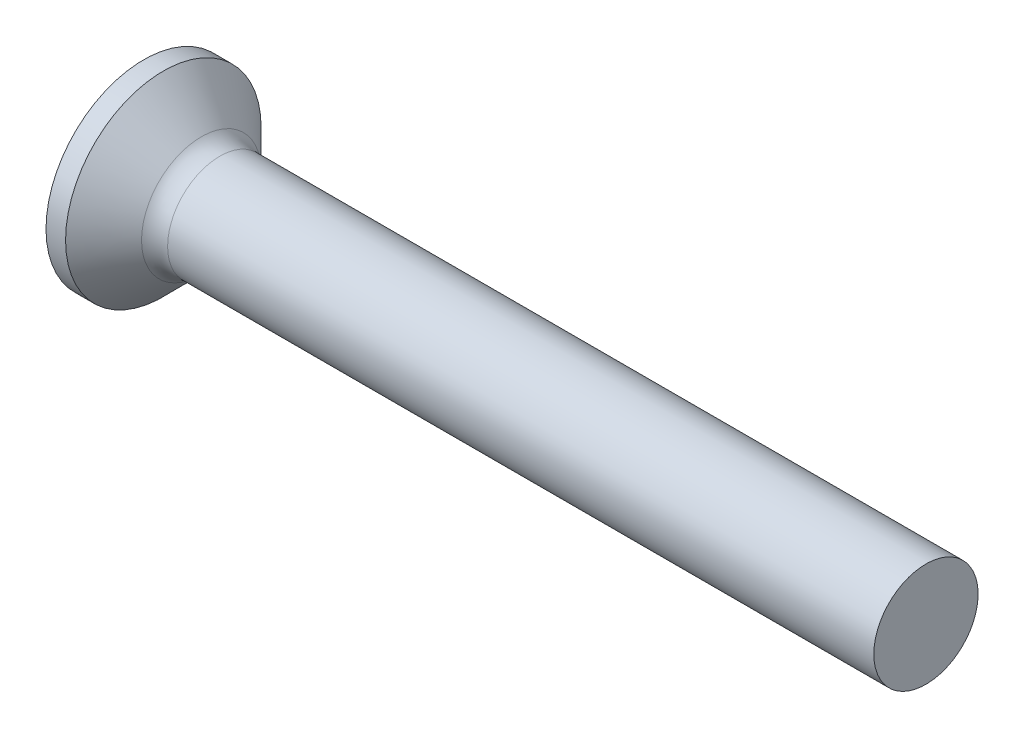
ISO-10303-21;
HEADER;
FILE_DESCRIPTION(('STEP AP214'),'2;1');
FILE_NAME('part.step','',(''),(''),'','','');
FILE_SCHEMA(('AUTOMOTIVE_DESIGN { 1 0 10303 214 1 1 1 1 }'));
ENDSEC;
DATA;
#1=APPLICATION_CONTEXT('core data for automotive mechanical design processes');
#2=APPLICATION_PROTOCOL_DEFINITION('international standard','automotive_design',2000,#1);
#3=PRODUCT_CONTEXT('',#1,'mechanical');
#4=PRODUCT('Part','Part','',(#3));
#5=PRODUCT_RELATED_PRODUCT_CATEGORY('part','',(#4));
#6=PRODUCT_DEFINITION_FORMATION('','',#4);
#7=PRODUCT_DEFINITION_CONTEXT('part definition',#1,'design');
#8=PRODUCT_DEFINITION('design','',#6,#7);
#9=PRODUCT_DEFINITION_SHAPE('','',#8);
#10=(LENGTH_UNIT() NAMED_UNIT(*) SI_UNIT(.MILLI.,.METRE.));
#11=(NAMED_UNIT(*) PLANE_ANGLE_UNIT() SI_UNIT($,.RADIAN.));
#12=(NAMED_UNIT(*) SI_UNIT($,.STERADIAN.) SOLID_ANGLE_UNIT());
#13=UNCERTAINTY_MEASURE_WITH_UNIT(LENGTH_MEASURE(1.E-05),#10,'distance_accuracy_value','');
#14=(GEOMETRIC_REPRESENTATION_CONTEXT(3) GLOBAL_UNCERTAINTY_ASSIGNED_CONTEXT((#13)) GLOBAL_UNIT_ASSIGNED_CONTEXT((#10,
#11,#12)) REPRESENTATION_CONTEXT('',''));
#15=CARTESIAN_POINT('',(0.,0.,0.));
#16=DIRECTION('',(0.,0.,1.));
#17=DIRECTION('',(1.,0.,0.));
#18=AXIS2_PLACEMENT_3D('',#15,#16,#17);
#19=CARTESIAN_POINT('',(0.,0.,0.));
#20=DIRECTION('',(-1.,0.,0.));
#21=DIRECTION('',(0.,0.,1.));
#22=AXIS2_PLACEMENT_3D('',#19,#20,#21);
#23=PLANE('',#22);
#24=CARTESIAN_POINT('',(0.,0.,0.));
#25=DIRECTION('',(-1.,0.,0.));
#26=DIRECTION('',(0.,0.,1.));
#27=AXIS2_PLACEMENT_3D('',#24,#25,#26);
#28=CIRCLE('',#27,1.5);
#29=CARTESIAN_POINT('',(0.,0.,1.5));
#30=VERTEX_POINT('',#29);
#31=EDGE_CURVE('E346',#30,#30,#28,.T.);
#32=ORIENTED_EDGE('',*,*,#31,.T.);
#33=EDGE_LOOP('',(#32));
#34=FACE_BOUND('',#33,.T.);
#35=DIRECTION('',(0.,0.,-1.));
#36=VECTOR('',#35,1.);
#37=CARTESIAN_POINT('',(0.,-0.240000000000003,0.799999999999999));
#38=LINE('',#37,#36);
#39=CARTESIAN_POINT('',(0.,-0.240000000000003,0.799999999999999));
#40=VERTEX_POINT('',#39);
#41=CARTESIAN_POINT('',(0.,-0.240000000000001,0.347023518872328));
#42=VERTEX_POINT('',#41);
#43=EDGE_CURVE('E384',#40,#42,#38,.T.);
#44=ORIENTED_EDGE('',*,*,#43,.T.);
#45=CARTESIAN_POINT('',(0.,0.,0.));
#46=DIRECTION('',(-1.,0.,0.));
#47=DIRECTION('',(0.,0.,1.));
#48=AXIS2_PLACEMENT_3D('',#45,#46,#47);
#49=CIRCLE('',#48,0.421930471346327);
#50=CARTESIAN_POINT('',(0.,-0.347023518872329,0.24));
#51=VERTEX_POINT('',#50);
#52=EDGE_CURVE('E372',#51,#42,#49,.T.);
#53=ORIENTED_EDGE('',*,*,#52,.F.);
#54=DIRECTION('',(0.,-1.,0.));
#55=VECTOR('',#54,1.);
#56=CARTESIAN_POINT('',(0.,0.8,0.24));
#57=LINE('',#56,#55);
#58=CARTESIAN_POINT('',(0.,-0.8,0.24));
#59=VERTEX_POINT('',#58);
#60=EDGE_CURVE('E431',#51,#59,#57,.T.);
#61=ORIENTED_EDGE('',*,*,#60,.T.);
#62=DIRECTION('',(0.,0.,-1.));
#63=VECTOR('',#62,1.);
#64=CARTESIAN_POINT('',(0.,-0.8,0.24));
#65=LINE('',#64,#63);
#66=CARTESIAN_POINT('',(0.,-0.8,-0.239999999999999));
#67=VERTEX_POINT('',#66);
#68=EDGE_CURVE('E343',#59,#67,#65,.T.);
#69=ORIENTED_EDGE('',*,*,#68,.T.);
#70=DIRECTION('',(0.,1.,0.));
#71=VECTOR('',#70,1.);
#72=CARTESIAN_POINT('',(0.,-0.8,-0.239999999999999));
#73=LINE('',#72,#71);
#74=CARTESIAN_POINT('',(0.,-0.34702351887233,-0.239999999999999));
#75=VERTEX_POINT('',#74);
#76=EDGE_CURVE('E432',#67,#75,#73,.T.);
#77=ORIENTED_EDGE('',*,*,#76,.T.);
#78=CARTESIAN_POINT('',(0.,-0.239999999999999,-0.34702351887233));
#79=VERTEX_POINT('',#78);
#80=EDGE_CURVE('E378',#79,#75,#49,.T.);
#81=ORIENTED_EDGE('',*,*,#80,.F.);
#82=CARTESIAN_POINT('',(0.,-0.239999999999997,-0.800000000000001));
#83=VERTEX_POINT('',#82);
#84=EDGE_CURVE('E393',#79,#83,#38,.T.);
#85=ORIENTED_EDGE('',*,*,#84,.T.);
#86=DIRECTION('',(0.,1.,0.));
#87=VECTOR('',#86,1.);
#88=CARTESIAN_POINT('',(0.,-0.239999999999997,-0.800000000000001));
#89=LINE('',#88,#87);
#90=CARTESIAN_POINT('',(0.,0.240000000000002,-0.799999999999999));
#91=VERTEX_POINT('',#90);
#92=EDGE_CURVE('E392',#83,#91,#89,.T.);
#93=ORIENTED_EDGE('',*,*,#92,.T.);
#94=DIRECTION('',(0.,0.,1.));
#95=VECTOR('',#94,1.);
#96=CARTESIAN_POINT('',(0.,0.240000000000002,-0.799999999999999));
#97=LINE('',#96,#95);
#98=CARTESIAN_POINT('',(0.,0.240000000000001,-0.347023518872329));
#99=VERTEX_POINT('',#98);
#100=EDGE_CURVE('E399',#91,#99,#97,.T.);
#101=ORIENTED_EDGE('',*,*,#100,.T.);
#102=CARTESIAN_POINT('',(0.,0.34702351887233,-0.239999999999999));
#103=VERTEX_POINT('',#102);
#104=EDGE_CURVE('E466',#103,#99,#49,.T.);
#105=ORIENTED_EDGE('',*,*,#104,.F.);
#106=CARTESIAN_POINT('',(0.,0.8,-0.239999999999999));
#107=VERTEX_POINT('',#106);
#108=EDGE_CURVE('E440',#103,#107,#73,.T.);
#109=ORIENTED_EDGE('',*,*,#108,.T.);
#110=DIRECTION('',(0.,0.,1.));
#111=VECTOR('',#110,1.);
#112=CARTESIAN_POINT('',(0.,0.8,-0.239999999999999));
#113=LINE('',#112,#111);
#114=CARTESIAN_POINT('',(0.,0.8,0.24));
#115=VERTEX_POINT('',#114);
#116=EDGE_CURVE('E428',#107,#115,#113,.T.);
#117=ORIENTED_EDGE('',*,*,#116,.T.);
#118=CARTESIAN_POINT('',(0.,0.347023518872329,0.24));
#119=VERTEX_POINT('',#118);
#120=EDGE_CURVE('E433',#115,#119,#57,.T.);
#121=ORIENTED_EDGE('',*,*,#120,.T.);
#122=CARTESIAN_POINT('',(0.,0.239999999999998,0.34702351887233));
#123=VERTEX_POINT('',#122);
#124=EDGE_CURVE('E380',#123,#119,#49,.T.);
#125=ORIENTED_EDGE('',*,*,#124,.F.);
#126=CARTESIAN_POINT('',(0.,0.239999999999997,0.800000000000001));
#127=VERTEX_POINT('',#126);
#128=EDGE_CURVE('E402',#123,#127,#97,.T.);
#129=ORIENTED_EDGE('',*,*,#128,.T.);
#130=DIRECTION('',(0.,-1.,0.));
#131=VECTOR('',#130,1.);
#132=CARTESIAN_POINT('',(0.,0.239999999999997,0.800000000000001));
#133=LINE('',#132,#131);
#134=EDGE_CURVE('E391',#127,#40,#133,.T.);
#135=ORIENTED_EDGE('',*,*,#134,.T.);
#136=EDGE_LOOP('',(#44,#53,#61,#69,#77,#81,#85,#93,#101,#105,#109,#117,#121,#125,#129,#135));
#137=FACE_BOUND('',#136,.T.);
#138=ADVANCED_FACE('F35',(#34,#137),#23,.T.);
#139=CARTESIAN_POINT('',(0.95,-0.326347488692666,0.24));
#140=DIRECTION('',(0.,0.,-1.));
#141=DIRECTION('',(-1.,0.,0.));
#142=AXIS2_PLACEMENT_3D('',#139,#140,#141);
#143=PLANE('',#142);
#144=ORIENTED_EDGE('',*,*,#60,.F.);
#145=CARTESIAN_POINT('',(-0.651308324051186,-0.401163684302684,0.24));
#146=CARTESIAN_POINT('',(-0.522861863423229,-0.390692537611785,0.24));
#147=CARTESIAN_POINT('',(-0.394423280810911,-0.380122888200533,0.24));
#148=CARTESIAN_POINT('',(-0.137565725712791,-0.35870652715565,0.24));
#149=CARTESIAN_POINT('',(-0.00914675385586902,-0.347859807988965,0.24));
#150=CARTESIAN_POINT('',(0.247660709587631,-0.325809813961883,0.24));
#151=CARTESIAN_POINT('',(0.37604920117974,-0.31460653916624,0.24));
#152=CARTESIAN_POINT('',(0.632780200612272,-0.291709176963063,0.24));
#153=CARTESIAN_POINT('',(0.761122709211896,-0.280015098074868,0.24));
#154=CARTESIAN_POINT('',(1.03836859128507,-0.253994892877437,0.24));
#155=CARTESIAN_POINT('',(1.18726080464485,-0.239547839796262,0.24));
#156=CARTESIAN_POINT('',(1.41048207830554,-0.216688570727189,0.24));
#157=CARTESIAN_POINT('',(1.48487148618842,-0.208870492985274,0.240000000000001));
#158=CARTESIAN_POINT('',(1.63358847070035,-0.192653926901128,0.240000000000001));
#159=CARTESIAN_POINT('',(1.70791604589332,-0.184255425439444,0.240000000000001));
#160=CARTESIAN_POINT('',(1.78220022482756,-0.175474749355936,0.240000000000001));
#161=B_SPLINE_CURVE_WITH_KNOTS('',3,(#145,#146,#147,#148,#149,#150,#151,#152,#153,#154,#155,
#156,#157,#158,#159,#160),.UNSPECIFIED.,.F.,.F.,(4,2,2,2,2,2,2,4),(0.,0.386617875839184,
0.77324627436866,1.15987460268182,1.54649622270294,1.99526496205244,2.21966034721123,
2.44406080609181),.UNSPECIFIED.);
#162=CARTESIAN_POINT('',(0.95,-0.262259890185288,0.24));
#163=VERTEX_POINT('',#162);
#164=EDGE_CURVE('E375',#51,#163,#161,.T.);
#165=ORIENTED_EDGE('',*,*,#164,.T.);
#166=DIRECTION('',(0.,-1.,0.));
#167=VECTOR('',#166,1.);
#168=CARTESIAN_POINT('',(0.95,0.326347488692666,0.24));
#169=LINE('',#168,#167);
#170=CARTESIAN_POINT('',(0.95,-0.326347488692666,0.24));
#171=VERTEX_POINT('',#170);
#172=EDGE_CURVE('E447',#163,#171,#169,.T.);
#173=ORIENTED_EDGE('',*,*,#172,.T.);
#174=DIRECTION('',(0.89493436774996,0.446197800778958,0.));
#175=VECTOR('',#174,1.);
#176=CARTESIAN_POINT('',(0.,-0.8,0.24));
#177=LINE('',#176,#175);
#178=EDGE_CURVE('E321',#59,#171,#177,.T.);
#179=ORIENTED_EDGE('',*,*,#178,.F.);
#180=EDGE_LOOP('',(#144,#165,#173,#179));
#181=FACE_BOUND('',#180,.T.);
#182=ADVANCED_FACE('F189',(#181),#143,.T.);
#183=CARTESIAN_POINT('',(0.95,0.326347488692666,0.24));
#184=VERTEX_POINT('',#183);
#185=CARTESIAN_POINT('',(0.95,0.262259890185288,0.24));
#186=VERTEX_POINT('',#185);
#187=EDGE_CURVE('E330',#184,#186,#169,.T.);
#188=ORIENTED_EDGE('',*,*,#187,.T.);
#189=CARTESIAN_POINT('',(-0.651308324051403,0.401163684302702,0.239999999999999));
#190=CARTESIAN_POINT('',(-0.522861863423424,0.390692537611801,0.24));
#191=CARTESIAN_POINT('',(-0.394423280811084,0.380122888200548,0.24));
#192=CARTESIAN_POINT('',(-0.137565725712921,0.358706527155661,0.24));
#193=CARTESIAN_POINT('',(-0.00914675385597726,0.347859807988975,0.24));
#194=CARTESIAN_POINT('',(0.247660709587598,0.325809813961886,0.24));
#195=CARTESIAN_POINT('',(0.37604920117976,0.314606539166238,0.24));
#196=CARTESIAN_POINT('',(0.632780200612397,0.291709176963051,0.24));
#197=CARTESIAN_POINT('',(0.761122709212074,0.280015098074852,0.24));
#198=CARTESIAN_POINT('',(1.0383685912853,0.253994892877415,0.24));
#199=CARTESIAN_POINT('',(1.18726080464508,0.239547839796239,0.24));
#200=CARTESIAN_POINT('',(1.41048207830576,0.216688570727165,0.24));
#201=CARTESIAN_POINT('',(1.48487148618865,0.208870492985249,0.24));
#202=CARTESIAN_POINT('',(1.63358847070058,0.192653926901103,0.24));
#203=CARTESIAN_POINT('',(1.70791604589355,0.184255425439417,0.240000000000001));
#204=CARTESIAN_POINT('',(1.78220022482779,0.175474749355909,0.240000000000001));
#205=B_SPLINE_CURVE_WITH_KNOTS('',3,(#189,#190,#191,#192,#193,#194,#195,#196,#197,#198,#199,
#200,#201,#202,#203,#204),.UNSPECIFIED.,.F.,.F.,(4,2,2,2,2,2,2,4),(0.,0.386617875839249,
0.773246274368791,1.15987460268211,1.54649622270339,1.99526496205289,2.21966034721168,
2.44406080609226),.UNSPECIFIED.);
#206=EDGE_CURVE('E249',#186,#119,#205,.F.);
#207=ORIENTED_EDGE('',*,*,#206,.T.);
#208=ORIENTED_EDGE('',*,*,#120,.F.);
#209=DIRECTION('',(0.89493436774996,-0.446197800778958,0.));
#210=VECTOR('',#209,1.);
#211=CARTESIAN_POINT('',(0.,0.8,0.24));
#212=LINE('',#211,#210);
#213=EDGE_CURVE('E58',#115,#184,#212,.T.);
#214=ORIENTED_EDGE('',*,*,#213,.T.);
#215=EDGE_LOOP('',(#188,#207,#208,#214));
#216=FACE_BOUND('',#215,.T.);
#217=ADVANCED_FACE('F194',(#216),#143,.T.);
#218=CARTESIAN_POINT('',(0.95,0.326347488692666,-0.24));
#219=DIRECTION('',(0.,0.,1.));
#220=DIRECTION('',(1.,0.,0.));
#221=AXIS2_PLACEMENT_3D('',#218,#219,#220);
#222=PLANE('',#221);
#223=DIRECTION('',(0.,1.,0.));
#224=VECTOR('',#223,1.);
#225=CARTESIAN_POINT('',(0.95,-0.326347488692666,-0.24));
#226=LINE('',#225,#224);
#227=CARTESIAN_POINT('',(0.95,-0.326347488692666,-0.24));
#228=VERTEX_POINT('',#227);
#229=CARTESIAN_POINT('',(0.95,-0.262259890185288,-0.239999999999999));
#230=VERTEX_POINT('',#229);
#231=EDGE_CURVE('E334',#228,#230,#226,.T.);
#232=ORIENTED_EDGE('',*,*,#231,.T.);
#233=CARTESIAN_POINT('',(-0.651308324051186,-0.401163684302684,-0.239999999999999));
#234=CARTESIAN_POINT('',(-0.522861863423229,-0.390692537611785,-0.239999999999999));
#235=CARTESIAN_POINT('',(-0.394423280810911,-0.380122888200534,-0.239999999999999));
#236=CARTESIAN_POINT('',(-0.137565725712791,-0.358706527155651,-0.239999999999999));
#237=CARTESIAN_POINT('',(-0.00914675385586895,-0.347859807988966,-0.239999999999999));
#238=CARTESIAN_POINT('',(0.247660709587631,-0.325809813961883,-0.239999999999999));
#239=CARTESIAN_POINT('',(0.376049201179741,-0.31460653916624,-0.24));
#240=CARTESIAN_POINT('',(0.632780200612273,-0.291709176963063,-0.24));
#241=CARTESIAN_POINT('',(0.761122709211897,-0.280015098074868,-0.24));
#242=CARTESIAN_POINT('',(1.03836859128507,-0.253994892877438,-0.24));
#243=CARTESIAN_POINT('',(1.18726080464485,-0.239547839796262,-0.24));
#244=CARTESIAN_POINT('',(1.41048207830554,-0.216688570727189,-0.24));
#245=CARTESIAN_POINT('',(1.48487148618842,-0.208870492985274,-0.24));
#246=CARTESIAN_POINT('',(1.63358847070035,-0.192653926901128,-0.24));
#247=CARTESIAN_POINT('',(1.70791604589332,-0.184255425439444,-0.24));
#248=CARTESIAN_POINT('',(1.78220022482756,-0.175474749355936,-0.240000000000001));
#249=B_SPLINE_CURVE_WITH_KNOTS('',3,(#233,#234,#235,#236,#237,#238,#239,#240,#241,#242,#243,
#244,#245,#246,#247,#248),.UNSPECIFIED.,.F.,.F.,(4,2,2,2,2,2,2,4),(0.,0.386617875839184,
0.77324627436866,1.15987460268182,1.54649622270294,1.99526496205244,2.21966034721123,
2.44406080609181),.UNSPECIFIED.);
#250=EDGE_CURVE('E243',#230,#75,#249,.F.);
#251=ORIENTED_EDGE('',*,*,#250,.T.);
#252=ORIENTED_EDGE('',*,*,#76,.F.);
#253=DIRECTION('',(0.89493436774996,0.446197800778958,0.));
#254=VECTOR('',#253,1.);
#255=CARTESIAN_POINT('',(0.,-0.8,-0.239999999999999));
#256=LINE('',#255,#254);
#257=EDGE_CURVE('E442',#67,#228,#256,.T.);
#258=ORIENTED_EDGE('',*,*,#257,.T.);
#259=EDGE_LOOP('',(#232,#251,#252,#258));
#260=FACE_BOUND('',#259,.T.);
#261=ADVANCED_FACE('F229',(#260),#222,.T.);
#262=ORIENTED_EDGE('',*,*,#108,.F.);
#263=CARTESIAN_POINT('',(-0.651308324051186,0.401163684302684,-0.239999999999999));
#264=CARTESIAN_POINT('',(-0.522861863423229,0.390692537611785,-0.239999999999999));
#265=CARTESIAN_POINT('',(-0.394423280810911,0.380122888200534,-0.239999999999999));
#266=CARTESIAN_POINT('',(-0.137565725712791,0.358706527155651,-0.239999999999999));
#267=CARTESIAN_POINT('',(-0.00914675385586895,0.347859807988966,-0.239999999999999));
#268=CARTESIAN_POINT('',(0.247660709587631,0.325809813961883,-0.239999999999999));
#269=CARTESIAN_POINT('',(0.376049201179741,0.31460653916624,-0.24));
#270=CARTESIAN_POINT('',(0.632780200612273,0.291709176963063,-0.24));
#271=CARTESIAN_POINT('',(0.761122709211897,0.280015098074868,-0.24));
#272=CARTESIAN_POINT('',(1.03836859128507,0.253994892877438,-0.24));
#273=CARTESIAN_POINT('',(1.18726080464485,0.239547839796262,-0.24));
#274=CARTESIAN_POINT('',(1.41048207830554,0.216688570727189,-0.24));
#275=CARTESIAN_POINT('',(1.48487148618842,0.208870492985274,-0.24));
#276=CARTESIAN_POINT('',(1.63358847070035,0.192653926901128,-0.24));
#277=CARTESIAN_POINT('',(1.70791604589332,0.184255425439444,-0.24));
#278=CARTESIAN_POINT('',(1.78220022482756,0.175474749355936,-0.240000000000001));
#279=B_SPLINE_CURVE_WITH_KNOTS('',3,(#263,#264,#265,#266,#267,#268,#269,#270,#271,#272,#273,
#274,#275,#276,#277,#278),.UNSPECIFIED.,.F.,.F.,(4,2,2,2,2,2,2,4),(0.,0.386617875839184,
0.77324627436866,1.15987460268182,1.54649622270294,1.99526496205244,2.21966034721123,
2.44406080609181),.UNSPECIFIED.);
#280=CARTESIAN_POINT('',(0.95,0.262259890185288,-0.239999999999999));
#281=VERTEX_POINT('',#280);
#282=EDGE_CURVE('E237',#103,#281,#279,.T.);
#283=ORIENTED_EDGE('',*,*,#282,.T.);
#284=CARTESIAN_POINT('',(0.95,0.326347488692666,-0.24));
#285=VERTEX_POINT('',#284);
#286=EDGE_CURVE('E338',#281,#285,#226,.T.);
#287=ORIENTED_EDGE('',*,*,#286,.T.);
#288=DIRECTION('',(0.89493436774996,-0.446197800778958,0.));
#289=VECTOR('',#288,1.);
#290=CARTESIAN_POINT('',(0.,0.8,-0.239999999999999));
#291=LINE('',#290,#289);
#292=EDGE_CURVE('E325',#107,#285,#291,.T.);
#293=ORIENTED_EDGE('',*,*,#292,.F.);
#294=EDGE_LOOP('',(#262,#283,#287,#293));
#295=FACE_BOUND('',#294,.T.);
#296=ADVANCED_FACE('F221',(#295),#222,.T.);
#297=CARTESIAN_POINT('',(0.95,-0.326347488692666,-0.24));
#298=DIRECTION('',(-1.,0.,0.));
#299=DIRECTION('',(0.,0.,1.));
#300=AXIS2_PLACEMENT_3D('',#297,#298,#299);
#301=PLANE('',#300);
#302=DIRECTION('',(0.,-1.,0.));
#303=VECTOR('',#302,1.);
#304=CARTESIAN_POINT('',(0.95,0.239999999999999,0.326347488692667));
#305=LINE('',#304,#303);
#306=CARTESIAN_POINT('',(0.95,-0.140987824382074,0.326347488692665));
#307=VERTEX_POINT('',#306);
#308=CARTESIAN_POINT('',(0.95,-0.240000000000001,0.326347488692665));
#309=VERTEX_POINT('',#308);
#310=EDGE_CURVE('E419',#307,#309,#305,.T.);
#311=ORIENTED_EDGE('',*,*,#310,.F.);
#312=CARTESIAN_POINT('',(0.95,0.,0.));
#313=DIRECTION('',(-1.,0.,0.));
#314=DIRECTION('',(0.,0.,1.));
#315=AXIS2_PLACEMENT_3D('',#312,#313,#314);
#316=CIRCLE('',#315,0.355499999999999);
#317=CARTESIAN_POINT('',(0.95,-0.240000000000001,0.262259890185287));
#318=VERTEX_POINT('',#317);
#319=EDGE_CURVE('E50',#318,#307,#316,.T.);
#320=ORIENTED_EDGE('',*,*,#319,.F.);
#321=DIRECTION('',(0.,0.,-1.));
#322=VECTOR('',#321,1.);
#323=CARTESIAN_POINT('',(0.95,-0.240000000000001,0.326347488692665));
#324=LINE('',#323,#322);
#325=EDGE_CURVE('E387',#309,#318,#324,.T.);
#326=ORIENTED_EDGE('',*,*,#325,.F.);
#327=EDGE_LOOP('',(#311,#320,#326));
#328=FACE_BOUND('',#327,.T.);
#329=ADVANCED_FACE('F217',(#328),#301,.T.);
#330=ORIENTED_EDGE('',*,*,#172,.F.);
#331=CARTESIAN_POINT('',(0.95,-0.326347488692666,0.14098782438207));
#332=VERTEX_POINT('',#331);
#333=EDGE_CURVE('E479',#332,#163,#316,.T.);
#334=ORIENTED_EDGE('',*,*,#333,.F.);
#335=DIRECTION('',(0.,0.,-1.));
#336=VECTOR('',#335,1.);
#337=CARTESIAN_POINT('',(0.95,-0.326347488692666,0.24));
#338=LINE('',#337,#336);
#339=EDGE_CURVE('E316',#171,#332,#338,.T.);
#340=ORIENTED_EDGE('',*,*,#339,.F.);
#341=EDGE_LOOP('',(#330,#334,#340));
#342=FACE_BOUND('',#341,.T.);
#343=ADVANCED_FACE('F220',(#342),#301,.T.);
#344=CARTESIAN_POINT('',(0.95,-0.326347488692666,-0.14098782438207));
#345=VERTEX_POINT('',#344);
#346=EDGE_CURVE('E326',#345,#228,#338,.T.);
#347=ORIENTED_EDGE('',*,*,#346,.F.);
#348=EDGE_CURVE('E483',#230,#345,#316,.T.);
#349=ORIENTED_EDGE('',*,*,#348,.F.);
#350=ORIENTED_EDGE('',*,*,#231,.F.);
#351=EDGE_LOOP('',(#347,#349,#350));
#352=FACE_BOUND('',#351,.T.);
#353=ADVANCED_FACE('F518',(#352),#301,.T.);
#354=CARTESIAN_POINT('',(0.95,-0.239999999999999,-0.262259890185288));
#355=VERTEX_POINT('',#354);
#356=CARTESIAN_POINT('',(0.95,-0.239999999999999,-0.326347488692667));
#357=VERTEX_POINT('',#356);
#358=EDGE_CURVE('E418',#355,#357,#324,.T.);
#359=ORIENTED_EDGE('',*,*,#358,.F.);
#360=CARTESIAN_POINT('',(0.95,-0.140987824382069,-0.326347488692666));
#361=VERTEX_POINT('',#360);
#362=EDGE_CURVE('E511',#361,#355,#316,.T.);
#363=ORIENTED_EDGE('',*,*,#362,.F.);
#364=DIRECTION('',(0.,1.,0.));
#365=VECTOR('',#364,1.);
#366=CARTESIAN_POINT('',(0.95,-0.239999999999999,-0.326347488692667));
#367=LINE('',#366,#365);
#368=EDGE_CURVE('E414',#357,#361,#367,.T.);
#369=ORIENTED_EDGE('',*,*,#368,.F.);
#370=EDGE_LOOP('',(#359,#363,#369));
#371=FACE_BOUND('',#370,.T.);
#372=ADVANCED_FACE('F520',(#371),#301,.T.);
#373=CARTESIAN_POINT('',(0.95,0.140987824382071,-0.326347488692666));
#374=VERTEX_POINT('',#373);
#375=CARTESIAN_POINT('',(0.95,0.240000000000001,-0.326347488692665));
#376=VERTEX_POINT('',#375);
#377=EDGE_CURVE('E421',#374,#376,#367,.T.);
#378=ORIENTED_EDGE('',*,*,#377,.F.);
#379=CARTESIAN_POINT('',(0.95,0.240000000000001,-0.262259890185287));
#380=VERTEX_POINT('',#379);
#381=EDGE_CURVE('E505',#380,#374,#316,.T.);
#382=ORIENTED_EDGE('',*,*,#381,.F.);
#383=DIRECTION('',(0.,0.,1.));
#384=VECTOR('',#383,1.);
#385=CARTESIAN_POINT('',(0.95,0.240000000000001,-0.326347488692665));
#386=LINE('',#385,#384);
#387=EDGE_CURVE('E424',#376,#380,#386,.T.);
#388=ORIENTED_EDGE('',*,*,#387,.F.);
#389=EDGE_LOOP('',(#378,#382,#388));
#390=FACE_BOUND('',#389,.T.);
#391=ADVANCED_FACE('F525',(#390),#301,.T.);
#392=ORIENTED_EDGE('',*,*,#286,.F.);
#393=CARTESIAN_POINT('',(0.95,0.326347488692666,-0.140987824382071));
#394=VERTEX_POINT('',#393);
#395=EDGE_CURVE('E464',#394,#281,#316,.T.);
#396=ORIENTED_EDGE('',*,*,#395,.F.);
#397=DIRECTION('',(0.,0.,1.));
#398=VECTOR('',#397,1.);
#399=CARTESIAN_POINT('',(0.95,0.326347488692666,-0.24));
#400=LINE('',#399,#398);
#401=EDGE_CURVE('E445',#285,#394,#400,.T.);
#402=ORIENTED_EDGE('',*,*,#401,.F.);
#403=EDGE_LOOP('',(#392,#396,#402));
#404=FACE_BOUND('',#403,.T.);
#405=ADVANCED_FACE('F501',(#404),#301,.T.);
#406=CARTESIAN_POINT('',(0.95,0.326347488692666,0.140987824382071));
#407=VERTEX_POINT('',#406);
#408=EDGE_CURVE('E337',#407,#184,#400,.T.);
#409=ORIENTED_EDGE('',*,*,#408,.F.);
#410=EDGE_CURVE('E458',#186,#407,#316,.T.);
#411=ORIENTED_EDGE('',*,*,#410,.F.);
#412=ORIENTED_EDGE('',*,*,#187,.F.);
#413=EDGE_LOOP('',(#409,#411,#412));
#414=FACE_BOUND('',#413,.T.);
#415=ADVANCED_FACE('F310',(#414),#301,.T.);
#416=CARTESIAN_POINT('',(0.95,0.239999999999999,0.262259890185289));
#417=VERTEX_POINT('',#416);
#418=CARTESIAN_POINT('',(0.95,0.239999999999999,0.326347488692667));
#419=VERTEX_POINT('',#418);
#420=EDGE_CURVE('E427',#417,#419,#386,.T.);
#421=ORIENTED_EDGE('',*,*,#420,.F.);
#422=CARTESIAN_POINT('',(0.95,0.14098782438207,0.326347488692666));
#423=VERTEX_POINT('',#422);
#424=EDGE_CURVE('E379',#423,#417,#316,.T.);
#425=ORIENTED_EDGE('',*,*,#424,.F.);
#426=EDGE_CURVE('E415',#419,#423,#305,.T.);
#427=ORIENTED_EDGE('',*,*,#426,.F.);
#428=EDGE_LOOP('',(#421,#425,#427));
#429=FACE_BOUND('',#428,.T.);
#430=ADVANCED_FACE('F223',(#429),#301,.T.);
#431=CARTESIAN_POINT('',(0.95,-0.326347488692666,-0.24));
#432=DIRECTION('',(-0.446197800778958,0.894934367749961,0.));
#433=DIRECTION('',(-0.89493436774996,-0.446197800778958,0.));
#434=AXIS2_PLACEMENT_3D('',#431,#432,#433);
#435=PLANE('',#434);
#436=ORIENTED_EDGE('',*,*,#339,.T.);
#437=CARTESIAN_POINT('',(1.51567645017231,-0.0443116242594752,0.));
#438=DIRECTION('',(-0.446197800778958,0.894934367749961,0.));
#439=DIRECTION('',(-0.89493436774996,-0.446197800778958,0.));
#440=AXIS2_PLACEMENT_3D('',#437,#438,#439);
#441=ELLIPSE('',#440,0.70808069581779,0.312821230434679);
#442=EDGE_CURVE('E317',#332,#345,#441,.F.);
#443=ORIENTED_EDGE('',*,*,#442,.T.);
#444=ORIENTED_EDGE('',*,*,#346,.T.);
#445=ORIENTED_EDGE('',*,*,#257,.F.);
#446=ORIENTED_EDGE('',*,*,#68,.F.);
#447=ORIENTED_EDGE('',*,*,#178,.T.);
#448=EDGE_LOOP('',(#436,#443,#444,#445,#446,#447));
#449=FACE_BOUND('',#448,.T.);
#450=ADVANCED_FACE('F228',(#449),#435,.T.);
#451=CARTESIAN_POINT('',(0.,0.8,0.24));
#452=DIRECTION('',(-0.446197800778958,-0.89493436774996,0.));
#453=DIRECTION('',(0.89493436774996,-0.446197800778958,0.));
#454=AXIS2_PLACEMENT_3D('',#451,#452,#453);
#455=PLANE('',#454);
#456=ORIENTED_EDGE('',*,*,#401,.T.);
#457=CARTESIAN_POINT('',(1.51567645017231,0.0443116242594755,0.));
#458=DIRECTION('',(-0.446197800778958,-0.89493436774996,0.));
#459=DIRECTION('',(-0.89493436774996,0.446197800778958,0.));
#460=AXIS2_PLACEMENT_3D('',#457,#458,#459);
#461=ELLIPSE('',#460,0.708080695817788,0.312821230434679);
#462=EDGE_CURVE('E290',#394,#407,#461,.F.);
#463=ORIENTED_EDGE('',*,*,#462,.T.);
#464=ORIENTED_EDGE('',*,*,#408,.T.);
#465=ORIENTED_EDGE('',*,*,#213,.F.);
#466=ORIENTED_EDGE('',*,*,#116,.F.);
#467=ORIENTED_EDGE('',*,*,#292,.T.);
#468=EDGE_LOOP('',(#456,#463,#464,#465,#466,#467));
#469=FACE_BOUND('',#468,.T.);
#470=ADVANCED_FACE('F224',(#469),#455,.T.);
#471=CARTESIAN_POINT('',(0.95,-0.239999999999999,-0.326347488692667));
#472=DIRECTION('',(0.,1.,0.));
#473=DIRECTION('',(-1.,0.,0.));
#474=AXIS2_PLACEMENT_3D('',#471,#472,#473);
#475=PLANE('',#474);
#476=ORIENTED_EDGE('',*,*,#84,.F.);
#477=CARTESIAN_POINT('',(-0.651308324051403,-0.239999999999998,-0.401163684302702));
#478=CARTESIAN_POINT('',(-0.522861863423424,-0.239999999999998,-0.390692537611802));
#479=CARTESIAN_POINT('',(-0.394423280811084,-0.239999999999998,-0.380122888200549));
#480=CARTESIAN_POINT('',(-0.137565725712921,-0.239999999999999,-0.358706527155662));
#481=CARTESIAN_POINT('',(-0.00914675385597725,-0.239999999999999,-0.347859807988975));
#482=CARTESIAN_POINT('',(0.247660709587598,-0.239999999999999,-0.325809813961886));
#483=CARTESIAN_POINT('',(0.37604920117976,-0.239999999999999,-0.314606539166239));
#484=CARTESIAN_POINT('',(0.632780200612397,-0.239999999999999,-0.291709176963052));
#485=CARTESIAN_POINT('',(0.761122709212074,-0.239999999999999,-0.280015098074853));
#486=CARTESIAN_POINT('',(1.0383685912853,-0.239999999999999,-0.253994892877416));
#487=CARTESIAN_POINT('',(1.18726080464508,-0.24,-0.23954783979624));
#488=CARTESIAN_POINT('',(1.41048207830576,-0.24,-0.216688570727166));
#489=CARTESIAN_POINT('',(1.48487148618865,-0.24,-0.20887049298525));
#490=CARTESIAN_POINT('',(1.63358847070058,-0.24,-0.192653926901104));
#491=CARTESIAN_POINT('',(1.70791604589355,-0.24,-0.184255425439418));
#492=CARTESIAN_POINT('',(1.78220022482779,-0.24,-0.175474749355909));
#493=B_SPLINE_CURVE_WITH_KNOTS('',3,(#477,#478,#479,#480,#481,#482,#483,#484,#485,#486,#487,
#488,#489,#490,#491,#492),.UNSPECIFIED.,.F.,.F.,(4,2,2,2,2,2,2,4),(0.,0.386617875839249,
0.773246274368792,1.15987460268211,1.54649622270339,1.99526496205289,2.21966034721168,
2.44406080609226),.UNSPECIFIED.);
#494=EDGE_CURVE('E283',#79,#355,#493,.T.);
#495=ORIENTED_EDGE('',*,*,#494,.T.);
#496=ORIENTED_EDGE('',*,*,#358,.T.);
#497=DIRECTION('',(0.89493436774996,0.,0.446197800778958));
#498=VECTOR('',#497,1.);
#499=CARTESIAN_POINT('',(0.,-0.239999999999997,-0.800000000000001));
#500=LINE('',#499,#498);
#501=EDGE_CURVE('E403',#83,#357,#500,.T.);
#502=ORIENTED_EDGE('',*,*,#501,.F.);
#503=EDGE_LOOP('',(#476,#495,#496,#502));
#504=FACE_BOUND('',#503,.T.);
#505=ADVANCED_FACE('F227',(#504),#475,.T.);
#506=CARTESIAN_POINT('',(0.95,0.239999999999999,0.326347488692667));
#507=DIRECTION('',(0.,-1.,0.));
#508=DIRECTION('',(1.,0.,0.));
#509=AXIS2_PLACEMENT_3D('',#506,#507,#508);
#510=PLANE('',#509);
#511=ORIENTED_EDGE('',*,*,#387,.T.);
#512=CARTESIAN_POINT('',(-0.651308324051186,0.24,-0.401163684302684));
#513=CARTESIAN_POINT('',(-0.522861863423229,0.24,-0.390692537611784));
#514=CARTESIAN_POINT('',(-0.394423280810911,0.24,-0.380122888200533));
#515=CARTESIAN_POINT('',(-0.137565725712791,0.24,-0.35870652715565));
#516=CARTESIAN_POINT('',(-0.00914675385586904,0.240000000000001,-0.347859807988965));
#517=CARTESIAN_POINT('',(0.247660709587631,0.240000000000001,-0.325809813961882));
#518=CARTESIAN_POINT('',(0.37604920117974,0.240000000000001,-0.314606539166239));
#519=CARTESIAN_POINT('',(0.632780200612272,0.240000000000001,-0.291709176963062));
#520=CARTESIAN_POINT('',(0.761122709211896,0.240000000000001,-0.280015098074868));
#521=CARTESIAN_POINT('',(1.03836859128507,0.240000000000001,-0.253994892877437));
#522=CARTESIAN_POINT('',(1.18726080464485,0.240000000000001,-0.239547839796261));
#523=CARTESIAN_POINT('',(1.41048207830553,0.240000000000001,-0.216688570727188));
#524=CARTESIAN_POINT('',(1.48487148618842,0.240000000000001,-0.208870492985273));
#525=CARTESIAN_POINT('',(1.63358847070035,0.240000000000001,-0.192653926901128));
#526=CARTESIAN_POINT('',(1.70791604589332,0.240000000000001,-0.184255425439443));
#527=CARTESIAN_POINT('',(1.78220022482756,0.240000000000001,-0.175474749355935));
#528=B_SPLINE_CURVE_WITH_KNOTS('',3,(#512,#513,#514,#515,#516,#517,#518,#519,#520,#521,#522,
#523,#524,#525,#526,#527),.UNSPECIFIED.,.F.,.F.,(4,2,2,2,2,2,2,4),(0.,0.386617875839184,
0.77324627436866,1.15987460268182,1.54649622270294,1.99526496205244,2.21966034721123,
2.44406080609181),.UNSPECIFIED.);
#529=EDGE_CURVE('E277',#380,#99,#528,.F.);
#530=ORIENTED_EDGE('',*,*,#529,.T.);
#531=ORIENTED_EDGE('',*,*,#100,.F.);
#532=DIRECTION('',(0.89493436774996,0.,0.446197800778958));
#533=VECTOR('',#532,1.);
#534=CARTESIAN_POINT('',(0.,0.240000000000002,-0.799999999999999));
#535=LINE('',#534,#533);
#536=EDGE_CURVE('E406',#91,#376,#535,.T.);
#537=ORIENTED_EDGE('',*,*,#536,.T.);
#538=EDGE_LOOP('',(#511,#530,#531,#537));
#539=FACE_BOUND('',#538,.T.);
#540=ADVANCED_FACE('F293',(#539),#510,.T.);
#541=CARTESIAN_POINT('',(0.95,0.240000000000001,-0.326347488692665));
#542=DIRECTION('',(-0.446197800778958,0.,0.894934367749961));
#543=DIRECTION('',(-0.89493436774996,0.,-0.446197800778958));
#544=AXIS2_PLACEMENT_3D('',#541,#542,#543);
#545=PLANE('',#544);
#546=ORIENTED_EDGE('',*,*,#368,.T.);
#547=CARTESIAN_POINT('',(1.51567645017231,0.,-0.0443116242594752));
#548=DIRECTION('',(-0.446197800778958,0.,0.894934367749961));
#549=DIRECTION('',(-0.89493436774996,0.,-0.446197800778958));
#550=AXIS2_PLACEMENT_3D('',#547,#548,#549);
#551=ELLIPSE('',#550,0.70808069581779,0.312821230434679);
#552=EDGE_CURVE('E388',#361,#374,#551,.F.);
#553=ORIENTED_EDGE('',*,*,#552,.T.);
#554=ORIENTED_EDGE('',*,*,#377,.T.);
#555=ORIENTED_EDGE('',*,*,#536,.F.);
#556=ORIENTED_EDGE('',*,*,#92,.F.);
#557=ORIENTED_EDGE('',*,*,#501,.T.);
#558=EDGE_LOOP('',(#546,#553,#554,#555,#556,#557));
#559=FACE_BOUND('',#558,.T.);
#560=ADVANCED_FACE('F256',(#559),#545,.T.);
#561=ORIENTED_EDGE('',*,*,#325,.T.);
#562=CARTESIAN_POINT('',(-0.651308324051186,-0.240000000000001,0.401163684302683));
#563=CARTESIAN_POINT('',(-0.522861863423229,-0.240000000000001,0.390692537611784));
#564=CARTESIAN_POINT('',(-0.394423280810911,-0.240000000000001,0.380122888200533));
#565=CARTESIAN_POINT('',(-0.137565725712791,-0.240000000000001,0.358706527155649));
#566=CARTESIAN_POINT('',(-0.00914675385586904,-0.240000000000001,0.347859807988965));
#567=CARTESIAN_POINT('',(0.247660709587631,-0.240000000000001,0.325809813961882));
#568=CARTESIAN_POINT('',(0.376049201179741,-0.240000000000001,0.314606539166239));
#569=CARTESIAN_POINT('',(0.632780200612272,-0.240000000000001,0.291709176963062));
#570=CARTESIAN_POINT('',(0.761122709211896,-0.240000000000001,0.280015098074867));
#571=CARTESIAN_POINT('',(1.03836859128507,-0.240000000000001,0.253994892877436));
#572=CARTESIAN_POINT('',(1.18726080464485,-0.240000000000001,0.239547839796261));
#573=CARTESIAN_POINT('',(1.41048207830554,-0.240000000000001,0.216688570727188));
#574=CARTESIAN_POINT('',(1.48487148618842,-0.240000000000001,0.208870492985273));
#575=CARTESIAN_POINT('',(1.63358847070035,-0.240000000000001,0.192653926901127));
#576=CARTESIAN_POINT('',(1.70791604589332,-0.240000000000001,0.184255425439443));
#577=CARTESIAN_POINT('',(1.78220022482756,-0.240000000000001,0.175474749355935));
#578=B_SPLINE_CURVE_WITH_KNOTS('',3,(#562,#563,#564,#565,#566,#567,#568,#569,#570,#571,#572,
#573,#574,#575,#576,#577),.UNSPECIFIED.,.F.,.F.,(4,2,2,2,2,2,2,4),(0.,0.386617875839184,
0.77324627436866,1.15987460268182,1.54649622270294,1.99526496205244,2.21966034721123,
2.44406080609181),.UNSPECIFIED.);
#579=EDGE_CURVE('E270',#318,#42,#578,.F.);
#580=ORIENTED_EDGE('',*,*,#579,.T.);
#581=ORIENTED_EDGE('',*,*,#43,.F.);
#582=DIRECTION('',(0.89493436774996,0.,-0.446197800778958));
#583=VECTOR('',#582,1.);
#584=CARTESIAN_POINT('',(0.,-0.240000000000003,0.799999999999999));
#585=LINE('',#584,#583);
#586=EDGE_CURVE('E409',#40,#309,#585,.T.);
#587=ORIENTED_EDGE('',*,*,#586,.T.);
#588=EDGE_LOOP('',(#561,#580,#581,#587));
#589=FACE_BOUND('',#588,.T.);
#590=ADVANCED_FACE('F295',(#589),#475,.T.);
#591=ORIENTED_EDGE('',*,*,#128,.F.);
#592=CARTESIAN_POINT('',(-0.651308324051403,0.239999999999997,0.401163684302703));
#593=CARTESIAN_POINT('',(-0.522861863423424,0.239999999999998,0.390692537611802));
#594=CARTESIAN_POINT('',(-0.394423280811084,0.239999999999998,0.380122888200549));
#595=CARTESIAN_POINT('',(-0.137565725712921,0.239999999999998,0.358706527155662));
#596=CARTESIAN_POINT('',(-0.00914675385597711,0.239999999999998,0.347859807988976));
#597=CARTESIAN_POINT('',(0.247660709587598,0.239999999999998,0.325809813961887));
#598=CARTESIAN_POINT('',(0.37604920117976,0.239999999999998,0.314606539166239));
#599=CARTESIAN_POINT('',(0.632780200612397,0.239999999999999,0.291709176963052));
#600=CARTESIAN_POINT('',(0.761122709212074,0.239999999999999,0.280015098074853));
#601=CARTESIAN_POINT('',(1.0383685912853,0.239999999999999,0.253994892877416));
#602=CARTESIAN_POINT('',(1.18726080464508,0.239999999999999,0.23954783979624));
#603=CARTESIAN_POINT('',(1.41048207830576,0.24,0.216688570727166));
#604=CARTESIAN_POINT('',(1.48487148618865,0.24,0.20887049298525));
#605=CARTESIAN_POINT('',(1.63358847070058,0.24,0.192653926901104));
#606=CARTESIAN_POINT('',(1.70791604589355,0.24,0.184255425439418));
#607=CARTESIAN_POINT('',(1.78220022482779,0.24,0.17547474935591));
#608=B_SPLINE_CURVE_WITH_KNOTS('',3,(#592,#593,#594,#595,#596,#597,#598,#599,#600,#601,#602,
#603,#604,#605,#606,#607),.UNSPECIFIED.,.F.,.F.,(4,2,2,2,2,2,2,4),(0.,0.386617875839249,
0.773246274368791,1.15987460268211,1.54649622270339,1.99526496205289,2.21966034721168,
2.44406080609226),.UNSPECIFIED.);
#609=EDGE_CURVE('E261',#123,#417,#608,.T.);
#610=ORIENTED_EDGE('',*,*,#609,.T.);
#611=ORIENTED_EDGE('',*,*,#420,.T.);
#612=DIRECTION('',(0.89493436774996,0.,-0.446197800778958));
#613=VECTOR('',#612,1.);
#614=CARTESIAN_POINT('',(0.,0.239999999999997,0.800000000000001));
#615=LINE('',#614,#613);
#616=EDGE_CURVE('E411',#127,#419,#615,.T.);
#617=ORIENTED_EDGE('',*,*,#616,.F.);
#618=EDGE_LOOP('',(#591,#610,#611,#617));
#619=FACE_BOUND('',#618,.T.);
#620=ADVANCED_FACE('F301',(#619),#510,.T.);
#621=CARTESIAN_POINT('',(0.,-0.240000000000002,0.799999999999999));
#622=DIRECTION('',(-0.446197800778958,0.,-0.89493436774996));
#623=DIRECTION('',(0.89493436774996,0.,-0.446197800778958));
#624=AXIS2_PLACEMENT_3D('',#621,#622,#623);
#625=PLANE('',#624);
#626=ORIENTED_EDGE('',*,*,#426,.T.);
#627=CARTESIAN_POINT('',(1.51567645017231,0.,0.0443116242594755));
#628=DIRECTION('',(-0.446197800778958,0.,-0.89493436774996));
#629=DIRECTION('',(-0.89493436774996,0.,0.446197800778958));
#630=AXIS2_PLACEMENT_3D('',#627,#628,#629);
#631=ELLIPSE('',#630,0.708080695817788,0.312821230434679);
#632=EDGE_CURVE('E11',#423,#307,#631,.F.);
#633=ORIENTED_EDGE('',*,*,#632,.T.);
#634=ORIENTED_EDGE('',*,*,#310,.T.);
#635=ORIENTED_EDGE('',*,*,#586,.F.);
#636=ORIENTED_EDGE('',*,*,#134,.F.);
#637=ORIENTED_EDGE('',*,*,#616,.T.);
#638=EDGE_LOOP('',(#626,#633,#634,#635,#636,#637));
#639=FACE_BOUND('',#638,.T.);
#640=ADVANCED_FACE('F204',(#639),#625,.T.);
#641=CARTESIAN_POINT('',(-6.34999999999999,0.,0.));
#642=DIRECTION('',(-1.,0.,0.));
#643=DIRECTION('',(0.,0.,1.));
#644=AXIS2_PLACEMENT_3D('',#641,#642,#643);
#645=CYLINDRICAL_SURFACE('',#644,1.5);
#646=CARTESIAN_POINT('',(0.300000000000005,0.,0.));
#647=DIRECTION('',(-1.,0.,0.));
#648=DIRECTION('',(0.,0.,1.));
#649=AXIS2_PLACEMENT_3D('',#646,#647,#648);
#650=CIRCLE('',#649,1.5);
#651=CARTESIAN_POINT('',(0.300000000000005,0.,1.5));
#652=VERTEX_POINT('',#651);
#653=EDGE_CURVE('E342',#652,#652,#650,.T.);
#654=ORIENTED_EDGE('',*,*,#653,.T.);
#655=EDGE_LOOP('',(#654));
#656=FACE_BOUND('',#655,.T.);
#657=ORIENTED_EDGE('',*,*,#31,.F.);
#658=EDGE_LOOP('',(#657));
#659=FACE_BOUND('',#658,.T.);
#660=ADVANCED_FACE('F200',(#656,#659),#645,.T.);
#661=CARTESIAN_POINT('',(0.300000000000005,0.,0.));
#662=DIRECTION('',(-1.,0.,0.));
#663=DIRECTION('',(0.,0.,1.));
#664=AXIS2_PLACEMENT_3D('',#661,#662,#663);
#665=CONICAL_SURFACE('',#664,1.5,0.785398163397451);
#666=CARTESIAN_POINT('',(0.882842712474619,0.,0.));
#667=DIRECTION('',(-1.,0.,0.));
#668=DIRECTION('',(0.,0.,1.));
#669=AXIS2_PLACEMENT_3D('',#666,#667,#668);
#670=CIRCLE('',#669,0.917157287525382);
#671=CARTESIAN_POINT('',(0.882842712474619,0.,0.917157287525382));
#672=VERTEX_POINT('',#671);
#673=EDGE_CURVE('E348',#672,#672,#670,.T.);
#674=ORIENTED_EDGE('',*,*,#673,.T.);
#675=EDGE_LOOP('',(#674));
#676=FACE_BOUND('',#675,.T.);
#677=ORIENTED_EDGE('',*,*,#653,.F.);
#678=EDGE_LOOP('',(#677));
#679=FACE_BOUND('',#678,.T.);
#680=ADVANCED_FACE('F203',(#676,#679),#665,.T.);
#681=CARTESIAN_POINT('',(-6.34999999999999,0.,0.));
#682=DIRECTION('',(-1.,0.,0.));
#683=DIRECTION('',(0.,0.,1.));
#684=AXIS2_PLACEMENT_3D('',#681,#682,#683);
#685=CYLINDRICAL_SURFACE('',#684,0.8);
#686=CARTESIAN_POINT('',(1.16568542494924,0.,0.));
#687=DIRECTION('',(-1.,0.,0.));
#688=DIRECTION('',(0.,0.,1.));
#689=AXIS2_PLACEMENT_3D('',#686,#687,#688);
#690=CIRCLE('',#689,0.8);
#691=CARTESIAN_POINT('',(1.16568542494924,0.,0.8));
#692=VERTEX_POINT('',#691);
#693=EDGE_CURVE('E43',#692,#692,#690,.F.);
#694=ORIENTED_EDGE('',*,*,#693,.T.);
#695=EDGE_LOOP('',(#694));
#696=FACE_BOUND('',#695,.T.);
#697=CARTESIAN_POINT('',(12.,0.,0.));
#698=DIRECTION('',(-1.,0.,0.));
#699=DIRECTION('',(0.,0.,1.));
#700=AXIS2_PLACEMENT_3D('',#697,#698,#699);
#701=CIRCLE('',#700,0.8);
#702=CARTESIAN_POINT('',(12.,0.,0.8));
#703=VERTEX_POINT('',#702);
#704=EDGE_CURVE('E339',#703,#703,#701,.T.);
#705=ORIENTED_EDGE('',*,*,#704,.T.);
#706=EDGE_LOOP('',(#705));
#707=FACE_BOUND('',#706,.T.);
#708=ADVANCED_FACE('F208',(#696,#707),#685,.T.);
#709=CARTESIAN_POINT('',(12.,0.8,0.));
#710=DIRECTION('',(1.,0.,0.));
#711=DIRECTION('',(0.,0.,-1.));
#712=AXIS2_PLACEMENT_3D('',#709,#710,#711);
#713=PLANE('',#712);
#714=ORIENTED_EDGE('',*,*,#704,.F.);
#715=EDGE_LOOP('',(#714));
#716=FACE_BOUND('',#715,.T.);
#717=ADVANCED_FACE('F212',(#716),#713,.T.);
#718=CARTESIAN_POINT('',(1.16568542494924,0.,0.));
#719=DIRECTION('',(-1.,0.,0.));
#720=DIRECTION('',(0.,0.,1.));
#721=AXIS2_PLACEMENT_3D('',#718,#719,#720);
#722=TOROIDAL_SURFACE('',#721,1.2,0.4);
#723=ORIENTED_EDGE('',*,*,#693,.F.);
#724=EDGE_LOOP('',(#723));
#725=FACE_BOUND('',#724,.T.);
#726=ORIENTED_EDGE('',*,*,#673,.F.);
#727=EDGE_LOOP('',(#726));
#728=FACE_BOUND('',#727,.T.);
#729=ADVANCED_FACE('F37',(#725,#728),#722,.F.);
#730=CARTESIAN_POINT('',(0.95,0.,0.));
#731=DIRECTION('',(-1.,0.,0.));
#732=DIRECTION('',(0.,0.,1.));
#733=AXIS2_PLACEMENT_3D('',#730,#731,#732);
#734=CONICAL_SURFACE('',#733,0.355499999999999,0.0698131700797662);
#735=ORIENTED_EDGE('',*,*,#52,.T.);
#736=ORIENTED_EDGE('',*,*,#579,.F.);
#737=EDGE_CURVE('E482',#163,#318,#316,.T.);
#738=ORIENTED_EDGE('',*,*,#737,.F.);
#739=ORIENTED_EDGE('',*,*,#164,.F.);
#740=EDGE_LOOP('',(#735,#736,#738,#739));
#741=FACE_BOUND('',#740,.T.);
#742=ADVANCED_FACE('F186',(#741),#734,.F.);
#743=EDGE_CURVE('E461',#417,#186,#316,.T.);
#744=ORIENTED_EDGE('',*,*,#743,.F.);
#745=ORIENTED_EDGE('',*,*,#609,.F.);
#746=ORIENTED_EDGE('',*,*,#124,.T.);
#747=ORIENTED_EDGE('',*,*,#206,.F.);
#748=EDGE_LOOP('',(#744,#745,#746,#747));
#749=FACE_BOUND('',#748,.T.);
#750=ADVANCED_FACE('F364',(#749),#734,.F.);
#751=EDGE_CURVE('E514',#355,#230,#316,.T.);
#752=ORIENTED_EDGE('',*,*,#751,.F.);
#753=ORIENTED_EDGE('',*,*,#494,.F.);
#754=ORIENTED_EDGE('',*,*,#80,.T.);
#755=ORIENTED_EDGE('',*,*,#250,.F.);
#756=EDGE_LOOP('',(#752,#753,#754,#755));
#757=FACE_BOUND('',#756,.T.);
#758=ADVANCED_FACE('F369',(#757),#734,.F.);
#759=ORIENTED_EDGE('',*,*,#104,.T.);
#760=ORIENTED_EDGE('',*,*,#529,.F.);
#761=EDGE_CURVE('E504',#281,#380,#316,.T.);
#762=ORIENTED_EDGE('',*,*,#761,.F.);
#763=ORIENTED_EDGE('',*,*,#282,.F.);
#764=EDGE_LOOP('',(#759,#760,#762,#763));
#765=FACE_BOUND('',#764,.T.);
#766=ADVANCED_FACE('F701',(#765),#734,.F.);
#767=EDGE_CURVE('E481',#345,#332,#316,.T.);
#768=ORIENTED_EDGE('',*,*,#767,.F.);
#769=ORIENTED_EDGE('',*,*,#442,.F.);
#770=EDGE_LOOP('',(#768,#769));
#771=FACE_BOUND('',#770,.T.);
#772=ADVANCED_FACE('F703',(#771),#734,.F.);
#773=EDGE_CURVE('E462',#407,#394,#316,.T.);
#774=ORIENTED_EDGE('',*,*,#773,.F.);
#775=ORIENTED_EDGE('',*,*,#462,.F.);
#776=EDGE_LOOP('',(#774,#775));
#777=FACE_BOUND('',#776,.T.);
#778=ADVANCED_FACE('F708',(#777),#734,.F.);
#779=EDGE_CURVE('E508',#374,#361,#316,.T.);
#780=ORIENTED_EDGE('',*,*,#779,.F.);
#781=ORIENTED_EDGE('',*,*,#552,.F.);
#782=EDGE_LOOP('',(#780,#781));
#783=FACE_BOUND('',#782,.T.);
#784=ADVANCED_FACE('F183',(#783),#734,.F.);
#785=EDGE_CURVE('E465',#307,#423,#316,.T.);
#786=ORIENTED_EDGE('',*,*,#785,.F.);
#787=ORIENTED_EDGE('',*,*,#632,.F.);
#788=EDGE_LOOP('',(#786,#787));
#789=FACE_BOUND('',#788,.T.);
#790=ADVANCED_FACE('F178',(#789),#734,.F.);
#791=CARTESIAN_POINT('',(1.0655089520108,0.,0.));
#792=DIRECTION('',(-1.,0.,0.));
#793=DIRECTION('',(0.,0.,1.));
#794=AXIS2_PLACEMENT_3D('',#791,#792,#793);
#795=CONICAL_SURFACE('',#794,0.,1.25663706143592);
#796=ORIENTED_EDGE('',*,*,#424,.T.);
#797=ORIENTED_EDGE('',*,*,#743,.T.);
#798=ORIENTED_EDGE('',*,*,#410,.T.);
#799=ORIENTED_EDGE('',*,*,#773,.T.);
#800=ORIENTED_EDGE('',*,*,#395,.T.);
#801=ORIENTED_EDGE('',*,*,#761,.T.);
#802=ORIENTED_EDGE('',*,*,#381,.T.);
#803=ORIENTED_EDGE('',*,*,#779,.T.);
#804=ORIENTED_EDGE('',*,*,#362,.T.);
#805=ORIENTED_EDGE('',*,*,#751,.T.);
#806=ORIENTED_EDGE('',*,*,#348,.T.);
#807=ORIENTED_EDGE('',*,*,#767,.T.);
#808=ORIENTED_EDGE('',*,*,#333,.T.);
#809=ORIENTED_EDGE('',*,*,#737,.T.);
#810=ORIENTED_EDGE('',*,*,#319,.T.);
#811=ORIENTED_EDGE('',*,*,#785,.T.);
#812=EDGE_LOOP('',(#796,#797,#798,#799,#800,#801,#802,#803,#804,#805,#806,#807,#808,#809,#810,#811));
#813=FACE_BOUND('',#812,.T.);
#814=CARTESIAN_POINT('',(1.0655089520108,0.,0.));
#815=VERTEX_POINT('',#814);
#816=VERTEX_LOOP('',#815);
#817=FACE_BOUND('',#816,.T.);
#818=ADVANCED_FACE('F176',(#813,#817),#795,.F.);
#819=CLOSED_SHELL('',(#138,#182,#217,#261,#296,#329,#343,#353,#372,#391,#405,#415,#430,#450,
#470,#505,#540,#560,#590,#620,#640,#660,#680,#708,#717,#729,#742,#750,#758,#766,#772,#778,#784,
#790,#818));
#820=MANIFOLD_SOLID_BREP('B2',#819);
#821=ADVANCED_BREP_SHAPE_REPRESENTATION('',(#18,#820),#14);
#822=SHAPE_DEFINITION_REPRESENTATION(#9,#821);
ENDSEC;
END-ISO-10303-21;
